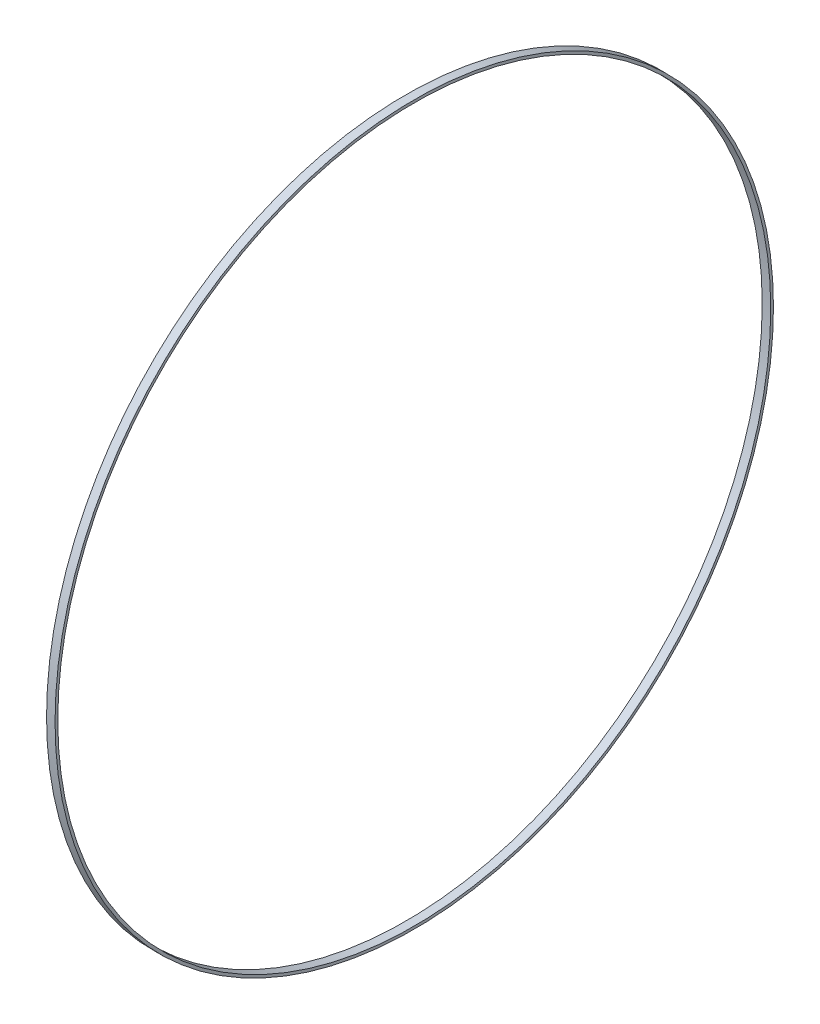
ISO-10303-21;
HEADER;
FILE_DESCRIPTION(('STEP AP214'),'2;1');
FILE_NAME('part.step','',(''),(''),'','','');
FILE_SCHEMA(('AUTOMOTIVE_DESIGN { 1 0 10303 214 1 1 1 1 }'));
ENDSEC;
DATA;
#1=APPLICATION_CONTEXT('core data for automotive mechanical design processes');
#2=APPLICATION_PROTOCOL_DEFINITION('international standard','automotive_design',2000,#1);
#3=PRODUCT_CONTEXT('',#1,'mechanical');
#4=PRODUCT('Part','Part','',(#3));
#5=PRODUCT_RELATED_PRODUCT_CATEGORY('part','',(#4));
#6=PRODUCT_DEFINITION_FORMATION('','',#4);
#7=PRODUCT_DEFINITION_CONTEXT('part definition',#1,'design');
#8=PRODUCT_DEFINITION('design','',#6,#7);
#9=PRODUCT_DEFINITION_SHAPE('','',#8);
#10=(LENGTH_UNIT() NAMED_UNIT(*) SI_UNIT(.MILLI.,.METRE.));
#11=(NAMED_UNIT(*) PLANE_ANGLE_UNIT() SI_UNIT($,.RADIAN.));
#12=(NAMED_UNIT(*) SI_UNIT($,.STERADIAN.) SOLID_ANGLE_UNIT());
#13=UNCERTAINTY_MEASURE_WITH_UNIT(LENGTH_MEASURE(1.E-05),#10,'distance_accuracy_value','');
#14=(GEOMETRIC_REPRESENTATION_CONTEXT(3) GLOBAL_UNCERTAINTY_ASSIGNED_CONTEXT((#13)) GLOBAL_UNIT_ASSIGNED_CONTEXT((#10,
#11,#12)) REPRESENTATION_CONTEXT('',''));
#15=CARTESIAN_POINT('',(0.,0.,0.));
#16=DIRECTION('',(0.,0.,1.));
#17=DIRECTION('',(1.,0.,0.));
#18=AXIS2_PLACEMENT_3D('',#15,#16,#17);
#19=CARTESIAN_POINT('',(25.,0.,0.));
#20=DIRECTION('',(1.,0.,0.));
#21=DIRECTION('',(0.,0.,-1.00000000000001));
#22=AXIS2_PLACEMENT_3D('',#19,#20,#21);
#23=PLANE('',#22);
#24=CARTESIAN_POINT('',(25.,0.,0.));
#25=DIRECTION('',(1.,0.,0.));
#26=DIRECTION('',(0.,0.,-1.00000000000001));
#27=AXIS2_PLACEMENT_3D('',#24,#25,#26);
#28=CIRCLE('',#27,1055.);
#29=CARTESIAN_POINT('',(25.,-1.75692793646931E-13,-1055.00000000001));
#30=VERTEX_POINT('',#29);
#31=EDGE_CURVE('E10',#30,#30,#28,.T.);
#32=ORIENTED_EDGE('',*,*,#31,.T.);
#33=EDGE_LOOP('',(#32));
#34=FACE_BOUND('',#33,.T.);
#35=CARTESIAN_POINT('',(25.,0.,0.));
#36=DIRECTION('',(1.,0.,0.));
#37=DIRECTION('',(0.,0.,-1.00000000000001));
#38=AXIS2_PLACEMENT_3D('',#35,#36,#37);
#39=CIRCLE('',#38,1047.);
#40=CARTESIAN_POINT('',(25.,-1.74360526017381E-13,-1047.00000000001));
#41=VERTEX_POINT('',#40);
#42=EDGE_CURVE('E41',#41,#41,#39,.T.);
#43=ORIENTED_EDGE('',*,*,#42,.F.);
#44=EDGE_LOOP('',(#43));
#45=FACE_BOUND('',#44,.T.);
#46=ADVANCED_FACE('F30',(#34,#45),#23,.T.);
#47=CARTESIAN_POINT('',(0.,0.,0.));
#48=DIRECTION('',(1.,0.,0.));
#49=DIRECTION('',(0.,0.,-1.00000000000001));
#50=AXIS2_PLACEMENT_3D('',#47,#48,#49);
#51=PLANE('',#50);
#52=CARTESIAN_POINT('',(0.,0.,0.));
#53=DIRECTION('',(1.,0.,0.));
#54=DIRECTION('',(0.,0.,-1.00000000000001));
#55=AXIS2_PLACEMENT_3D('',#52,#53,#54);
#56=CIRCLE('',#55,1055.);
#57=CARTESIAN_POINT('',(0.,-1.75692793646931E-13,-1055.00000000001));
#58=VERTEX_POINT('',#57);
#59=EDGE_CURVE('E34',#58,#58,#56,.T.);
#60=ORIENTED_EDGE('',*,*,#59,.F.);
#61=EDGE_LOOP('',(#60));
#62=FACE_BOUND('',#61,.T.);
#63=CARTESIAN_POINT('',(0.,0.,0.));
#64=DIRECTION('',(1.,0.,0.));
#65=DIRECTION('',(0.,0.,-1.00000000000001));
#66=AXIS2_PLACEMENT_3D('',#63,#64,#65);
#67=CIRCLE('',#66,1047.);
#68=CARTESIAN_POINT('',(0.,-1.74360526017381E-13,-1047.00000000001));
#69=VERTEX_POINT('',#68);
#70=EDGE_CURVE('E43',#69,#69,#67,.T.);
#71=ORIENTED_EDGE('',*,*,#70,.T.);
#72=EDGE_LOOP('',(#71));
#73=FACE_BOUND('',#72,.T.);
#74=ADVANCED_FACE('F53',(#62,#73),#51,.F.);
#75=CARTESIAN_POINT('',(25.,0.,0.));
#76=DIRECTION('',(-1.,0.,0.));
#77=DIRECTION('',(0.,0.,1.00000000000001));
#78=AXIS2_PLACEMENT_3D('',#75,#76,#77);
#79=CYLINDRICAL_SURFACE('',#78,1055.);
#80=ORIENTED_EDGE('',*,*,#31,.F.);
#81=EDGE_LOOP('',(#80));
#82=FACE_BOUND('',#81,.T.);
#83=ORIENTED_EDGE('',*,*,#59,.T.);
#84=EDGE_LOOP('',(#83));
#85=FACE_BOUND('',#84,.T.);
#86=ADVANCED_FACE('F32',(#82,#85),#79,.T.);
#87=CARTESIAN_POINT('',(25.,0.,0.));
#88=DIRECTION('',(-1.,0.,0.));
#89=DIRECTION('',(0.,0.,1.00000000000001));
#90=AXIS2_PLACEMENT_3D('',#87,#88,#89);
#91=CYLINDRICAL_SURFACE('',#90,1047.);
#92=ORIENTED_EDGE('',*,*,#42,.T.);
#93=EDGE_LOOP('',(#92));
#94=FACE_BOUND('',#93,.T.);
#95=ORIENTED_EDGE('',*,*,#70,.F.);
#96=EDGE_LOOP('',(#95));
#97=FACE_BOUND('',#96,.T.);
#98=ADVANCED_FACE('F49',(#94,#97),#91,.F.);
#99=CLOSED_SHELL('',(#46,#74,#86,#98));
#100=MANIFOLD_SOLID_BREP('B2',#99);
#101=ADVANCED_BREP_SHAPE_REPRESENTATION('',(#18,#100),#14);
#102=SHAPE_DEFINITION_REPRESENTATION(#9,#101);
ENDSEC;
END-ISO-10303-21;
